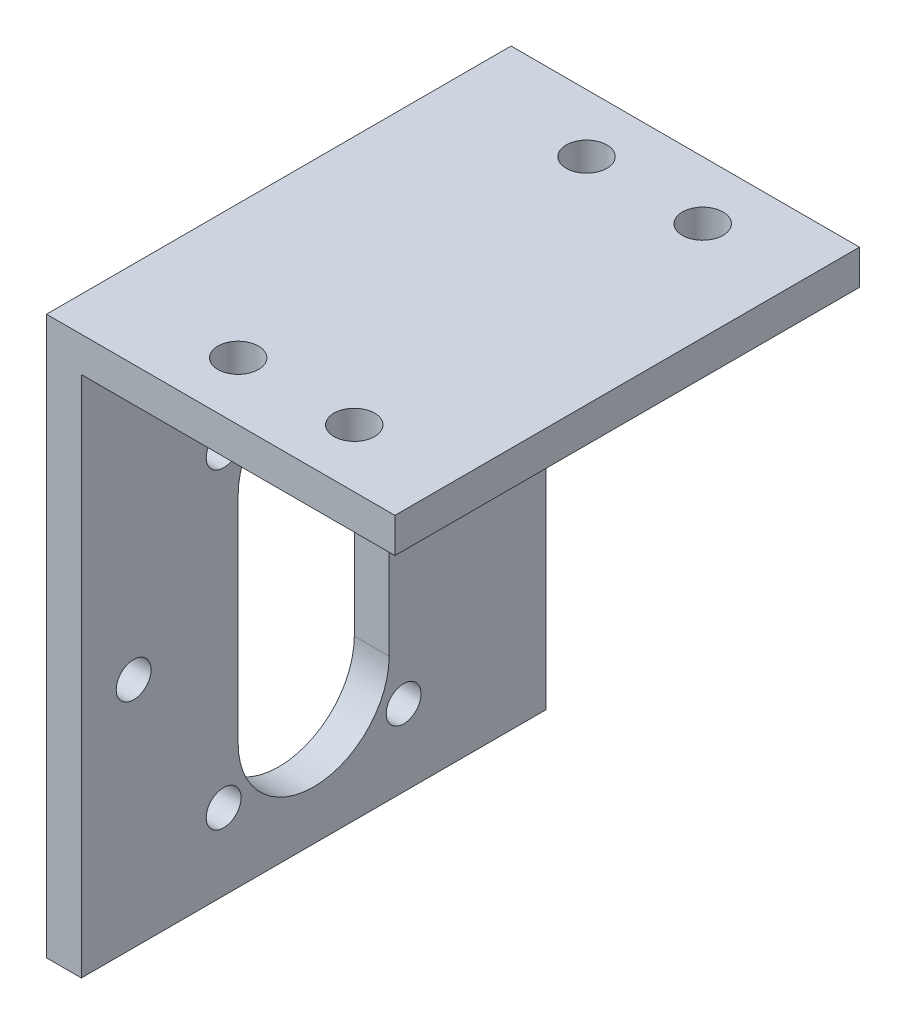
ISO-10303-21;
HEADER;
FILE_DESCRIPTION(('STEP AP214'),'2;1');
FILE_NAME('part.step','',(''),(''),'','','');
FILE_SCHEMA(('AUTOMOTIVE_DESIGN { 1 0 10303 214 1 1 1 1 }'));
ENDSEC;
DATA;
#1=APPLICATION_CONTEXT('core data for automotive mechanical design processes');
#2=APPLICATION_PROTOCOL_DEFINITION('international standard','automotive_design',2000,#1);
#3=PRODUCT_CONTEXT('',#1,'mechanical');
#4=PRODUCT('Part','Part','',(#3));
#5=PRODUCT_RELATED_PRODUCT_CATEGORY('part','',(#4));
#6=PRODUCT_DEFINITION_FORMATION('','',#4);
#7=PRODUCT_DEFINITION_CONTEXT('part definition',#1,'design');
#8=PRODUCT_DEFINITION('design','',#6,#7);
#9=PRODUCT_DEFINITION_SHAPE('','',#8);
#10=(LENGTH_UNIT() NAMED_UNIT(*) SI_UNIT(.MILLI.,.METRE.));
#11=(NAMED_UNIT(*) PLANE_ANGLE_UNIT() SI_UNIT($,.RADIAN.));
#12=(NAMED_UNIT(*) SI_UNIT($,.STERADIAN.) SOLID_ANGLE_UNIT());
#13=UNCERTAINTY_MEASURE_WITH_UNIT(LENGTH_MEASURE(1.E-05),#10,'distance_accuracy_value','');
#14=(GEOMETRIC_REPRESENTATION_CONTEXT(3) GLOBAL_UNCERTAINTY_ASSIGNED_CONTEXT((#13)) GLOBAL_UNIT_ASSIGNED_CONTEXT((#10,
#11,#12)) REPRESENTATION_CONTEXT('',''));
#15=CARTESIAN_POINT('',(0.,0.,0.));
#16=DIRECTION('',(0.,0.,1.));
#17=DIRECTION('',(1.,0.,0.));
#18=AXIS2_PLACEMENT_3D('',#15,#16,#17);
#19=CARTESIAN_POINT('',(0.,48.,0.));
#20=DIRECTION('',(1.,0.,0.));
#21=DIRECTION('',(0.,0.,-1.));
#22=AXIS2_PLACEMENT_3D('',#19,#20,#21);
#23=PLANE('',#22);
#24=CARTESIAN_POINT('',(0.,19.9999999999998,35.5));
#25=DIRECTION('',(-1.,0.,0.));
#26=DIRECTION('',(0.,0.,1.));
#27=AXIS2_PLACEMENT_3D('',#24,#25,#26);
#28=CIRCLE('',#27,1.5);
#29=CARTESIAN_POINT('',(0.,19.9999999999998,37.));
#30=VERTEX_POINT('',#29);
#31=EDGE_CURVE('E244',#30,#30,#28,.T.);
#32=ORIENTED_EDGE('',*,*,#31,.F.);
#33=EDGE_LOOP('',(#32));
#34=FACE_BOUND('',#33,.T.);
#35=CARTESIAN_POINT('',(0.,33.4233937586587,27.7500000000001));
#36=DIRECTION('',(-1.,0.,0.));
#37=DIRECTION('',(0.,0.,1.));
#38=AXIS2_PLACEMENT_3D('',#35,#36,#37);
#39=CIRCLE('',#38,1.5);
#40=CARTESIAN_POINT('',(0.,33.4233937586587,29.2500000000001));
#41=VERTEX_POINT('',#40);
#42=EDGE_CURVE('E234',#41,#41,#39,.T.);
#43=ORIENTED_EDGE('',*,*,#42,.F.);
#44=EDGE_LOOP('',(#43));
#45=FACE_BOUND('',#44,.T.);
#46=CARTESIAN_POINT('',(0.,33.4233937586589,12.2500000000001));
#47=DIRECTION('',(-1.,0.,0.));
#48=DIRECTION('',(0.,0.,1.));
#49=AXIS2_PLACEMENT_3D('',#46,#47,#48);
#50=CIRCLE('',#49,1.5);
#51=CARTESIAN_POINT('',(0.,33.4233937586589,13.7500000000001));
#52=VERTEX_POINT('',#51);
#53=EDGE_CURVE('E231',#52,#52,#50,.T.);
#54=ORIENTED_EDGE('',*,*,#53,.F.);
#55=EDGE_LOOP('',(#54));
#56=FACE_BOUND('',#55,.T.);
#57=CARTESIAN_POINT('',(0.,20.0000000000001,4.49999999999999));
#58=DIRECTION('',(-1.,0.,0.));
#59=DIRECTION('',(0.,0.,1.));
#60=AXIS2_PLACEMENT_3D('',#57,#58,#59);
#61=CIRCLE('',#60,1.5);
#62=CARTESIAN_POINT('',(0.,20.0000000000001,5.99999999999999));
#63=VERTEX_POINT('',#62);
#64=EDGE_CURVE('E228',#63,#63,#61,.T.);
#65=ORIENTED_EDGE('',*,*,#64,.F.);
#66=EDGE_LOOP('',(#65));
#67=FACE_BOUND('',#66,.T.);
#68=CARTESIAN_POINT('',(0.,6.57660624134121,12.25));
#69=DIRECTION('',(-1.,0.,0.));
#70=DIRECTION('',(0.,0.,1.));
#71=AXIS2_PLACEMENT_3D('',#68,#69,#70);
#72=CIRCLE('',#71,1.5);
#73=CARTESIAN_POINT('',(0.,6.57660624134121,13.75));
#74=VERTEX_POINT('',#73);
#75=EDGE_CURVE('E224',#74,#74,#72,.T.);
#76=ORIENTED_EDGE('',*,*,#75,.F.);
#77=EDGE_LOOP('',(#76));
#78=FACE_BOUND('',#77,.T.);
#79=CARTESIAN_POINT('',(0.,10.7478892517407,20.));
#80=DIRECTION('',(-1.,0.,0.));
#81=DIRECTION('',(0.,0.,-1.));
#82=AXIS2_PLACEMENT_3D('',#79,#80,#81);
#83=CIRCLE('',#82,6.49999999999999);
#84=CARTESIAN_POINT('',(0.,10.7478892517407,13.5));
#85=VERTEX_POINT('',#84);
#86=CARTESIAN_POINT('',(0.,10.7478892517407,26.5));
#87=VERTEX_POINT('',#86);
#88=EDGE_CURVE('E122',#85,#87,#83,.T.);
#89=ORIENTED_EDGE('',*,*,#88,.F.);
#90=DIRECTION('',(0.,-1.,0.));
#91=VECTOR('',#90,1.);
#92=CARTESIAN_POINT('',(0.,20.,13.5));
#93=LINE('',#92,#91);
#94=CARTESIAN_POINT('',(0.,29.2521107482593,13.5));
#95=VERTEX_POINT('',#94);
#96=EDGE_CURVE('E49',#95,#85,#93,.T.);
#97=ORIENTED_EDGE('',*,*,#96,.F.);
#98=CARTESIAN_POINT('',(0.,29.2521107482593,20.));
#99=DIRECTION('',(-1.,0.,0.));
#100=DIRECTION('',(0.,0.,1.));
#101=AXIS2_PLACEMENT_3D('',#98,#99,#100);
#102=CIRCLE('',#101,6.5);
#103=CARTESIAN_POINT('',(0.,29.2521107482593,26.5));
#104=VERTEX_POINT('',#103);
#105=EDGE_CURVE('E129',#104,#95,#102,.T.);
#106=ORIENTED_EDGE('',*,*,#105,.F.);
#107=DIRECTION('',(0.,1.,0.));
#108=VECTOR('',#107,1.);
#109=CARTESIAN_POINT('',(0.,20.,26.5));
#110=LINE('',#109,#108);
#111=EDGE_CURVE('E113',#87,#104,#110,.T.);
#112=ORIENTED_EDGE('',*,*,#111,.F.);
#113=EDGE_LOOP('',(#89,#97,#106,#112));
#114=FACE_BOUND('',#113,.T.);
#115=CARTESIAN_POINT('',(0.,6.57660624134121,27.75));
#116=DIRECTION('',(-1.,0.,0.));
#117=DIRECTION('',(0.,0.,1.));
#118=AXIS2_PLACEMENT_3D('',#115,#116,#117);
#119=CIRCLE('',#118,1.5);
#120=CARTESIAN_POINT('',(0.,6.57660624134121,29.25));
#121=VERTEX_POINT('',#120);
#122=EDGE_CURVE('E137',#121,#121,#119,.T.);
#123=ORIENTED_EDGE('',*,*,#122,.F.);
#124=EDGE_LOOP('',(#123));
#125=FACE_BOUND('',#124,.T.);
#126=DIRECTION('',(0.,0.,1.));
#127=VECTOR('',#126,1.);
#128=CARTESIAN_POINT('',(0.,0.,0.));
#129=LINE('',#128,#127);
#130=CARTESIAN_POINT('',(0.,0.,0.));
#131=VERTEX_POINT('',#130);
#132=CARTESIAN_POINT('',(0.,0.,40.));
#133=VERTEX_POINT('',#132);
#134=EDGE_CURVE('E187',#131,#133,#129,.T.);
#135=ORIENTED_EDGE('',*,*,#134,.T.);
#136=DIRECTION('',(0.,-1.,0.));
#137=VECTOR('',#136,1.);
#138=CARTESIAN_POINT('',(0.,48.,40.));
#139=LINE('',#138,#137);
#140=CARTESIAN_POINT('',(0.,48.,40.));
#141=VERTEX_POINT('',#140);
#142=EDGE_CURVE('E213',#141,#133,#139,.T.);
#143=ORIENTED_EDGE('',*,*,#142,.F.);
#144=DIRECTION('',(0.,0.,1.));
#145=VECTOR('',#144,1.);
#146=CARTESIAN_POINT('',(0.,48.,0.));
#147=LINE('',#146,#145);
#148=CARTESIAN_POINT('',(0.,48.,0.));
#149=VERTEX_POINT('',#148);
#150=EDGE_CURVE('E188',#149,#141,#147,.T.);
#151=ORIENTED_EDGE('',*,*,#150,.F.);
#152=DIRECTION('',(0.,-1.,0.));
#153=VECTOR('',#152,1.);
#154=CARTESIAN_POINT('',(0.,48.,0.));
#155=LINE('',#154,#153);
#156=EDGE_CURVE('E198',#149,#131,#155,.T.);
#157=ORIENTED_EDGE('',*,*,#156,.T.);
#158=EDGE_LOOP('',(#135,#143,#151,#157));
#159=FACE_BOUND('',#158,.T.);
#160=ADVANCED_FACE('F33',(#34,#45,#56,#67,#78,#114,#125,#159),#23,.F.);
#161=CARTESIAN_POINT('',(0.,48.,40.));
#162=DIRECTION('',(0.,0.,-1.));
#163=DIRECTION('',(-1.,0.,0.));
#164=AXIS2_PLACEMENT_3D('',#161,#162,#163);
#165=PLANE('',#164);
#166=DIRECTION('',(0.,-1.,0.));
#167=VECTOR('',#166,1.);
#168=CARTESIAN_POINT('',(3.,48.,40.));
#169=LINE('',#168,#167);
#170=CARTESIAN_POINT('',(3.,45.,40.));
#171=VERTEX_POINT('',#170);
#172=CARTESIAN_POINT('',(3.,0.,40.));
#173=VERTEX_POINT('',#172);
#174=EDGE_CURVE('E177',#171,#173,#169,.T.);
#175=ORIENTED_EDGE('',*,*,#174,.F.);
#176=DIRECTION('',(1.,0.,0.));
#177=VECTOR('',#176,1.);
#178=CARTESIAN_POINT('',(0.,45.,40.));
#179=LINE('',#178,#177);
#180=CARTESIAN_POINT('',(30.,45.,40.));
#181=VERTEX_POINT('',#180);
#182=EDGE_CURVE('E171',#171,#181,#179,.T.);
#183=ORIENTED_EDGE('',*,*,#182,.T.);
#184=DIRECTION('',(0.,-1.,0.));
#185=VECTOR('',#184,1.);
#186=CARTESIAN_POINT('',(30.,48.,40.));
#187=LINE('',#186,#185);
#188=CARTESIAN_POINT('',(30.,48.,40.));
#189=VERTEX_POINT('',#188);
#190=EDGE_CURVE('E210',#189,#181,#187,.T.);
#191=ORIENTED_EDGE('',*,*,#190,.F.);
#192=DIRECTION('',(1.,0.,0.));
#193=VECTOR('',#192,1.);
#194=CARTESIAN_POINT('',(0.,48.,40.));
#195=LINE('',#194,#193);
#196=EDGE_CURVE('E191',#141,#189,#195,.T.);
#197=ORIENTED_EDGE('',*,*,#196,.F.);
#198=ORIENTED_EDGE('',*,*,#142,.T.);
#199=DIRECTION('',(1.,0.,0.));
#200=VECTOR('',#199,1.);
#201=CARTESIAN_POINT('',(0.,0.,40.));
#202=LINE('',#201,#200);
#203=EDGE_CURVE('E201',#133,#173,#202,.T.);
#204=ORIENTED_EDGE('',*,*,#203,.T.);
#205=EDGE_LOOP('',(#175,#183,#191,#197,#198,#204));
#206=FACE_BOUND('',#205,.T.);
#207=ADVANCED_FACE('F254',(#206),#165,.F.);
#208=CARTESIAN_POINT('',(30.,48.,0.));
#209=DIRECTION('',(-1.,0.,0.));
#210=DIRECTION('',(0.,0.,1.));
#211=AXIS2_PLACEMENT_3D('',#208,#209,#210);
#212=PLANE('',#211);
#213=ORIENTED_EDGE('',*,*,#190,.T.);
#214=DIRECTION('',(0.,0.,-1.));
#215=VECTOR('',#214,1.);
#216=CARTESIAN_POINT('',(30.,45.,0.));
#217=LINE('',#216,#215);
#218=CARTESIAN_POINT('',(30.,45.,0.));
#219=VERTEX_POINT('',#218);
#220=EDGE_CURVE('E181',#181,#219,#217,.T.);
#221=ORIENTED_EDGE('',*,*,#220,.T.);
#222=DIRECTION('',(0.,-1.,0.));
#223=VECTOR('',#222,1.);
#224=CARTESIAN_POINT('',(30.,48.,0.));
#225=LINE('',#224,#223);
#226=CARTESIAN_POINT('',(30.,48.,0.));
#227=VERTEX_POINT('',#226);
#228=EDGE_CURVE('E207',#227,#219,#225,.T.);
#229=ORIENTED_EDGE('',*,*,#228,.F.);
#230=DIRECTION('',(0.,0.,-1.));
#231=VECTOR('',#230,1.);
#232=CARTESIAN_POINT('',(30.,48.,0.));
#233=LINE('',#232,#231);
#234=EDGE_CURVE('E194',#189,#227,#233,.T.);
#235=ORIENTED_EDGE('',*,*,#234,.F.);
#236=EDGE_LOOP('',(#213,#221,#229,#235));
#237=FACE_BOUND('',#236,.T.);
#238=ADVANCED_FACE('F259',(#237),#212,.F.);
#239=CARTESIAN_POINT('',(0.,48.,0.));
#240=DIRECTION('',(0.,0.,1.));
#241=DIRECTION('',(1.,0.,0.));
#242=AXIS2_PLACEMENT_3D('',#239,#240,#241);
#243=PLANE('',#242);
#244=DIRECTION('',(-1.,0.,0.));
#245=VECTOR('',#244,1.);
#246=CARTESIAN_POINT('',(0.,45.,0.));
#247=LINE('',#246,#245);
#248=CARTESIAN_POINT('',(3.,45.,0.));
#249=VERTEX_POINT('',#248);
#250=EDGE_CURVE('E178',#219,#249,#247,.T.);
#251=ORIENTED_EDGE('',*,*,#250,.T.);
#252=DIRECTION('',(0.,-1.,0.));
#253=VECTOR('',#252,1.);
#254=CARTESIAN_POINT('',(3.,48.,0.));
#255=LINE('',#254,#253);
#256=CARTESIAN_POINT('',(3.,0.,0.));
#257=VERTEX_POINT('',#256);
#258=EDGE_CURVE('E174',#249,#257,#255,.T.);
#259=ORIENTED_EDGE('',*,*,#258,.T.);
#260=DIRECTION('',(-1.,0.,0.));
#261=VECTOR('',#260,1.);
#262=CARTESIAN_POINT('',(0.,0.,0.));
#263=LINE('',#262,#261);
#264=EDGE_CURVE('E192',#257,#131,#263,.T.);
#265=ORIENTED_EDGE('',*,*,#264,.T.);
#266=ORIENTED_EDGE('',*,*,#156,.F.);
#267=DIRECTION('',(-1.,0.,0.));
#268=VECTOR('',#267,1.);
#269=CARTESIAN_POINT('',(0.,48.,0.));
#270=LINE('',#269,#268);
#271=EDGE_CURVE('E196',#227,#149,#270,.T.);
#272=ORIENTED_EDGE('',*,*,#271,.F.);
#273=ORIENTED_EDGE('',*,*,#228,.T.);
#274=EDGE_LOOP('',(#251,#259,#265,#266,#272,#273));
#275=FACE_BOUND('',#274,.T.);
#276=ADVANCED_FACE('F328',(#275),#243,.F.);
#277=CARTESIAN_POINT('',(0.,48.,0.));
#278=DIRECTION('',(0.,1.,0.));
#279=DIRECTION('',(0.,0.,1.));
#280=AXIS2_PLACEMENT_3D('',#277,#278,#279);
#281=PLANE('',#280);
#282=CARTESIAN_POINT('',(11.5,48.,5.));
#283=DIRECTION('',(0.,-1.,0.));
#284=DIRECTION('',(0.,0.,1.));
#285=AXIS2_PLACEMENT_3D('',#282,#283,#284);
#286=CIRCLE('',#285,1.75);
#287=CARTESIAN_POINT('',(11.5,48.,6.75));
#288=VERTEX_POINT('',#287);
#289=EDGE_CURVE('E143',#288,#288,#286,.T.);
#290=ORIENTED_EDGE('',*,*,#289,.T.);
#291=EDGE_LOOP('',(#290));
#292=FACE_BOUND('',#291,.T.);
#293=CARTESIAN_POINT('',(21.5,48.,5.));
#294=DIRECTION('',(0.,-1.,0.));
#295=DIRECTION('',(0.,0.,1.));
#296=AXIS2_PLACEMENT_3D('',#293,#294,#295);
#297=CIRCLE('',#296,1.75);
#298=CARTESIAN_POINT('',(21.5,48.,6.75));
#299=VERTEX_POINT('',#298);
#300=EDGE_CURVE('E150',#299,#299,#297,.T.);
#301=ORIENTED_EDGE('',*,*,#300,.T.);
#302=EDGE_LOOP('',(#301));
#303=FACE_BOUND('',#302,.T.);
#304=CARTESIAN_POINT('',(21.5,48.,35.));
#305=DIRECTION('',(0.,-1.,0.));
#306=DIRECTION('',(0.,0.,-1.));
#307=AXIS2_PLACEMENT_3D('',#304,#305,#306);
#308=CIRCLE('',#307,1.75);
#309=CARTESIAN_POINT('',(21.5,48.,33.25));
#310=VERTEX_POINT('',#309);
#311=EDGE_CURVE('E156',#310,#310,#308,.T.);
#312=ORIENTED_EDGE('',*,*,#311,.T.);
#313=EDGE_LOOP('',(#312));
#314=FACE_BOUND('',#313,.T.);
#315=CARTESIAN_POINT('',(11.5,48.,35.));
#316=DIRECTION('',(0.,-1.,0.));
#317=DIRECTION('',(0.,0.,-1.));
#318=AXIS2_PLACEMENT_3D('',#315,#316,#317);
#319=CIRCLE('',#318,1.75);
#320=CARTESIAN_POINT('',(11.5,48.,33.25));
#321=VERTEX_POINT('',#320);
#322=EDGE_CURVE('E162',#321,#321,#319,.T.);
#323=ORIENTED_EDGE('',*,*,#322,.T.);
#324=EDGE_LOOP('',(#323));
#325=FACE_BOUND('',#324,.T.);
#326=ORIENTED_EDGE('',*,*,#150,.T.);
#327=ORIENTED_EDGE('',*,*,#196,.T.);
#328=ORIENTED_EDGE('',*,*,#234,.T.);
#329=ORIENTED_EDGE('',*,*,#271,.T.);
#330=EDGE_LOOP('',(#326,#327,#328,#329));
#331=FACE_BOUND('',#330,.T.);
#332=ADVANCED_FACE('F325',(#292,#303,#314,#325,#331),#281,.T.);
#333=CARTESIAN_POINT('',(0.,0.,0.));
#334=DIRECTION('',(0.,1.,0.));
#335=DIRECTION('',(0.,0.,1.));
#336=AXIS2_PLACEMENT_3D('',#333,#334,#335);
#337=PLANE('',#336);
#338=ORIENTED_EDGE('',*,*,#264,.F.);
#339=DIRECTION('',(0.,0.,1.));
#340=VECTOR('',#339,1.);
#341=CARTESIAN_POINT('',(3.,0.,0.));
#342=LINE('',#341,#340);
#343=EDGE_CURVE('E165',#257,#173,#342,.T.);
#344=ORIENTED_EDGE('',*,*,#343,.T.);
#345=ORIENTED_EDGE('',*,*,#203,.F.);
#346=ORIENTED_EDGE('',*,*,#134,.F.);
#347=EDGE_LOOP('',(#338,#344,#345,#346));
#348=FACE_BOUND('',#347,.T.);
#349=ADVANCED_FACE('F320',(#348),#337,.F.);
#350=CARTESIAN_POINT('',(3.,48.,0.));
#351=DIRECTION('',(1.,0.,0.));
#352=DIRECTION('',(0.,0.,-1.));
#353=AXIS2_PLACEMENT_3D('',#350,#351,#352);
#354=PLANE('',#353);
#355=CARTESIAN_POINT('',(3.,19.9999999999998,35.5));
#356=DIRECTION('',(1.,0.,0.));
#357=DIRECTION('',(0.,0.,-1.));
#358=AXIS2_PLACEMENT_3D('',#355,#356,#357);
#359=CIRCLE('',#358,1.5);
#360=CARTESIAN_POINT('',(3.,19.9999999999998,34.));
#361=VERTEX_POINT('',#360);
#362=EDGE_CURVE('E36',#361,#361,#359,.T.);
#363=ORIENTED_EDGE('',*,*,#362,.F.);
#364=EDGE_LOOP('',(#363));
#365=FACE_BOUND('',#364,.T.);
#366=CARTESIAN_POINT('',(3.,33.4233937586587,27.7500000000001));
#367=DIRECTION('',(1.,0.,0.));
#368=DIRECTION('',(0.,0.,-1.));
#369=AXIS2_PLACEMENT_3D('',#366,#367,#368);
#370=CIRCLE('',#369,1.5);
#371=CARTESIAN_POINT('',(3.,33.4233937586587,26.2500000000001));
#372=VERTEX_POINT('',#371);
#373=EDGE_CURVE('E232',#372,#372,#370,.T.);
#374=ORIENTED_EDGE('',*,*,#373,.F.);
#375=EDGE_LOOP('',(#374));
#376=FACE_BOUND('',#375,.T.);
#377=CARTESIAN_POINT('',(3.,33.4233937586589,12.2500000000001));
#378=DIRECTION('',(1.,0.,0.));
#379=DIRECTION('',(0.,0.,-1.));
#380=AXIS2_PLACEMENT_3D('',#377,#378,#379);
#381=CIRCLE('',#380,1.5);
#382=CARTESIAN_POINT('',(3.,33.4233937586589,10.7500000000001));
#383=VERTEX_POINT('',#382);
#384=EDGE_CURVE('E229',#383,#383,#381,.T.);
#385=ORIENTED_EDGE('',*,*,#384,.F.);
#386=EDGE_LOOP('',(#385));
#387=FACE_BOUND('',#386,.T.);
#388=CARTESIAN_POINT('',(3.,20.0000000000001,4.49999999999999));
#389=DIRECTION('',(1.,0.,0.));
#390=DIRECTION('',(0.,0.,-1.));
#391=AXIS2_PLACEMENT_3D('',#388,#389,#390);
#392=CIRCLE('',#391,1.5);
#393=CARTESIAN_POINT('',(3.,20.0000000000001,2.99999999999999));
#394=VERTEX_POINT('',#393);
#395=EDGE_CURVE('E225',#394,#394,#392,.T.);
#396=ORIENTED_EDGE('',*,*,#395,.F.);
#397=EDGE_LOOP('',(#396));
#398=FACE_BOUND('',#397,.T.);
#399=CARTESIAN_POINT('',(3.,6.57660624134121,12.25));
#400=DIRECTION('',(1.,0.,0.));
#401=DIRECTION('',(0.,0.,-1.));
#402=AXIS2_PLACEMENT_3D('',#399,#400,#401);
#403=CIRCLE('',#402,1.5);
#404=CARTESIAN_POINT('',(3.,6.57660624134121,10.75));
#405=VERTEX_POINT('',#404);
#406=EDGE_CURVE('E125',#405,#405,#403,.T.);
#407=ORIENTED_EDGE('',*,*,#406,.F.);
#408=EDGE_LOOP('',(#407));
#409=FACE_BOUND('',#408,.T.);
#410=DIRECTION('',(0.,1.,0.));
#411=VECTOR('',#410,1.);
#412=CARTESIAN_POINT('',(3.,48.,13.5));
#413=LINE('',#412,#411);
#414=CARTESIAN_POINT('',(3.,10.7478892517407,13.5));
#415=VERTEX_POINT('',#414);
#416=CARTESIAN_POINT('',(3.,29.2521107482593,13.5));
#417=VERTEX_POINT('',#416);
#418=EDGE_CURVE('E11',#415,#417,#413,.T.);
#419=ORIENTED_EDGE('',*,*,#418,.F.);
#420=CARTESIAN_POINT('',(3.,10.7478892517407,20.));
#421=DIRECTION('',(1.,0.,0.));
#422=DIRECTION('',(0.,0.,-1.));
#423=AXIS2_PLACEMENT_3D('',#420,#421,#422);
#424=CIRCLE('',#423,6.49999999999999);
#425=CARTESIAN_POINT('',(3.,10.7478892517407,26.5));
#426=VERTEX_POINT('',#425);
#427=EDGE_CURVE('E216',#426,#415,#424,.T.);
#428=ORIENTED_EDGE('',*,*,#427,.F.);
#429=DIRECTION('',(0.,-1.,0.));
#430=VECTOR('',#429,1.);
#431=CARTESIAN_POINT('',(3.,48.,26.5));
#432=LINE('',#431,#430);
#433=CARTESIAN_POINT('',(3.,29.2521107482593,26.5));
#434=VERTEX_POINT('',#433);
#435=EDGE_CURVE('E116',#434,#426,#432,.T.);
#436=ORIENTED_EDGE('',*,*,#435,.F.);
#437=CARTESIAN_POINT('',(3.,29.2521107482593,20.));
#438=DIRECTION('',(1.,0.,0.));
#439=DIRECTION('',(0.,0.,-1.));
#440=AXIS2_PLACEMENT_3D('',#437,#438,#439);
#441=CIRCLE('',#440,6.5);
#442=EDGE_CURVE('E41',#417,#434,#441,.T.);
#443=ORIENTED_EDGE('',*,*,#442,.F.);
#444=EDGE_LOOP('',(#419,#428,#436,#443));
#445=FACE_BOUND('',#444,.T.);
#446=CARTESIAN_POINT('',(3.,6.57660624134121,27.75));
#447=DIRECTION('',(1.,0.,0.));
#448=DIRECTION('',(0.,0.,-1.));
#449=AXIS2_PLACEMENT_3D('',#446,#447,#448);
#450=CIRCLE('',#449,1.5);
#451=CARTESIAN_POINT('',(3.,6.57660624134121,26.25));
#452=VERTEX_POINT('',#451);
#453=EDGE_CURVE('E142',#452,#452,#450,.T.);
#454=ORIENTED_EDGE('',*,*,#453,.F.);
#455=EDGE_LOOP('',(#454));
#456=FACE_BOUND('',#455,.T.);
#457=ORIENTED_EDGE('',*,*,#343,.F.);
#458=ORIENTED_EDGE('',*,*,#258,.F.);
#459=DIRECTION('',(0.,0.,1.));
#460=VECTOR('',#459,1.);
#461=CARTESIAN_POINT('',(3.,45.,0.));
#462=LINE('',#461,#460);
#463=EDGE_CURVE('E168',#249,#171,#462,.T.);
#464=ORIENTED_EDGE('',*,*,#463,.T.);
#465=ORIENTED_EDGE('',*,*,#174,.T.);
#466=EDGE_LOOP('',(#457,#458,#464,#465));
#467=FACE_BOUND('',#466,.T.);
#468=ADVANCED_FACE('F317',(#365,#376,#387,#398,#409,#445,#456,#467),#354,.T.);
#469=CARTESIAN_POINT('',(0.,45.,0.));
#470=DIRECTION('',(0.,1.,0.));
#471=DIRECTION('',(0.,0.,1.));
#472=AXIS2_PLACEMENT_3D('',#469,#470,#471);
#473=PLANE('',#472);
#474=CARTESIAN_POINT('',(11.5,45.,5.));
#475=DIRECTION('',(0.,-1.,0.));
#476=DIRECTION('',(0.,0.,1.));
#477=AXIS2_PLACEMENT_3D('',#474,#475,#476);
#478=CIRCLE('',#477,1.75);
#479=CARTESIAN_POINT('',(11.5,45.,6.75));
#480=VERTEX_POINT('',#479);
#481=EDGE_CURVE('E147',#480,#480,#478,.T.);
#482=ORIENTED_EDGE('',*,*,#481,.F.);
#483=EDGE_LOOP('',(#482));
#484=FACE_BOUND('',#483,.T.);
#485=CARTESIAN_POINT('',(21.5,45.,5.));
#486=DIRECTION('',(0.,-1.,0.));
#487=DIRECTION('',(0.,0.,1.));
#488=AXIS2_PLACEMENT_3D('',#485,#486,#487);
#489=CIRCLE('',#488,1.75);
#490=CARTESIAN_POINT('',(21.5,45.,6.75));
#491=VERTEX_POINT('',#490);
#492=EDGE_CURVE('E146',#491,#491,#489,.T.);
#493=ORIENTED_EDGE('',*,*,#492,.F.);
#494=EDGE_LOOP('',(#493));
#495=FACE_BOUND('',#494,.T.);
#496=CARTESIAN_POINT('',(21.5,45.,35.));
#497=DIRECTION('',(0.,-1.,0.));
#498=DIRECTION('',(0.,0.,-1.));
#499=AXIS2_PLACEMENT_3D('',#496,#497,#498);
#500=CIRCLE('',#499,1.75);
#501=CARTESIAN_POINT('',(21.5,45.,33.25));
#502=VERTEX_POINT('',#501);
#503=EDGE_CURVE('E153',#502,#502,#500,.T.);
#504=ORIENTED_EDGE('',*,*,#503,.F.);
#505=EDGE_LOOP('',(#504));
#506=FACE_BOUND('',#505,.T.);
#507=CARTESIAN_POINT('',(11.5,45.,35.));
#508=DIRECTION('',(0.,-1.,0.));
#509=DIRECTION('',(0.,0.,-1.));
#510=AXIS2_PLACEMENT_3D('',#507,#508,#509);
#511=CIRCLE('',#510,1.75);
#512=CARTESIAN_POINT('',(11.5,45.,33.25));
#513=VERTEX_POINT('',#512);
#514=EDGE_CURVE('E159',#513,#513,#511,.T.);
#515=ORIENTED_EDGE('',*,*,#514,.F.);
#516=EDGE_LOOP('',(#515));
#517=FACE_BOUND('',#516,.T.);
#518=ORIENTED_EDGE('',*,*,#463,.F.);
#519=ORIENTED_EDGE('',*,*,#250,.F.);
#520=ORIENTED_EDGE('',*,*,#220,.F.);
#521=ORIENTED_EDGE('',*,*,#182,.F.);
#522=EDGE_LOOP('',(#518,#519,#520,#521));
#523=FACE_BOUND('',#522,.T.);
#524=ADVANCED_FACE('F315',(#484,#495,#506,#517,#523),#473,.F.);
#525=CARTESIAN_POINT('',(11.5,48.,35.));
#526=DIRECTION('',(0.,-1.,0.));
#527=DIRECTION('',(0.,0.,-1.));
#528=AXIS2_PLACEMENT_3D('',#525,#526,#527);
#529=CYLINDRICAL_SURFACE('',#528,1.75);
#530=ORIENTED_EDGE('',*,*,#322,.F.);
#531=EDGE_LOOP('',(#530));
#532=FACE_BOUND('',#531,.T.);
#533=ORIENTED_EDGE('',*,*,#514,.T.);
#534=EDGE_LOOP('',(#533));
#535=FACE_BOUND('',#534,.T.);
#536=ADVANCED_FACE('F311',(#532,#535),#529,.F.);
#537=CARTESIAN_POINT('',(21.5,48.,35.));
#538=DIRECTION('',(0.,-1.,0.));
#539=DIRECTION('',(0.,0.,-1.));
#540=AXIS2_PLACEMENT_3D('',#537,#538,#539);
#541=CYLINDRICAL_SURFACE('',#540,1.75);
#542=ORIENTED_EDGE('',*,*,#311,.F.);
#543=EDGE_LOOP('',(#542));
#544=FACE_BOUND('',#543,.T.);
#545=ORIENTED_EDGE('',*,*,#503,.T.);
#546=EDGE_LOOP('',(#545));
#547=FACE_BOUND('',#546,.T.);
#548=ADVANCED_FACE('F307',(#544,#547),#541,.F.);
#549=CARTESIAN_POINT('',(21.5,48.,5.));
#550=DIRECTION('',(0.,-1.,0.));
#551=DIRECTION('',(0.,0.,-1.));
#552=AXIS2_PLACEMENT_3D('',#549,#550,#551);
#553=CYLINDRICAL_SURFACE('',#552,1.75);
#554=ORIENTED_EDGE('',*,*,#300,.F.);
#555=EDGE_LOOP('',(#554));
#556=FACE_BOUND('',#555,.T.);
#557=ORIENTED_EDGE('',*,*,#492,.T.);
#558=EDGE_LOOP('',(#557));
#559=FACE_BOUND('',#558,.T.);
#560=ADVANCED_FACE('F303',(#556,#559),#553,.F.);
#561=CARTESIAN_POINT('',(11.5,48.,5.));
#562=DIRECTION('',(0.,-1.,0.));
#563=DIRECTION('',(0.,0.,-1.));
#564=AXIS2_PLACEMENT_3D('',#561,#562,#563);
#565=CYLINDRICAL_SURFACE('',#564,1.75);
#566=ORIENTED_EDGE('',*,*,#289,.F.);
#567=EDGE_LOOP('',(#566));
#568=FACE_BOUND('',#567,.T.);
#569=ORIENTED_EDGE('',*,*,#481,.T.);
#570=EDGE_LOOP('',(#569));
#571=FACE_BOUND('',#570,.T.);
#572=ADVANCED_FACE('F299',(#568,#571),#565,.F.);
#573=CARTESIAN_POINT('',(30.,6.57660624134121,27.75));
#574=DIRECTION('',(-1.,0.,0.));
#575=DIRECTION('',(0.,0.,1.));
#576=AXIS2_PLACEMENT_3D('',#573,#574,#575);
#577=CYLINDRICAL_SURFACE('',#576,1.5);
#578=ORIENTED_EDGE('',*,*,#453,.T.);
#579=EDGE_LOOP('',(#578));
#580=FACE_BOUND('',#579,.T.);
#581=ORIENTED_EDGE('',*,*,#122,.T.);
#582=EDGE_LOOP('',(#581));
#583=FACE_BOUND('',#582,.T.);
#584=ADVANCED_FACE('F289',(#580,#583),#577,.F.);
#585=CARTESIAN_POINT('',(30.,20.,13.5));
#586=DIRECTION('',(0.,0.,-1.));
#587=DIRECTION('',(-1.,0.,0.));
#588=AXIS2_PLACEMENT_3D('',#585,#586,#587);
#589=PLANE('',#588);
#590=ORIENTED_EDGE('',*,*,#418,.T.);
#591=DIRECTION('',(-1.,0.,0.));
#592=VECTOR('',#591,1.);
#593=CARTESIAN_POINT('',(30.,29.2521107482593,13.5));
#594=LINE('',#593,#592);
#595=EDGE_CURVE('E135',#417,#95,#594,.T.);
#596=ORIENTED_EDGE('',*,*,#595,.T.);
#597=ORIENTED_EDGE('',*,*,#96,.T.);
#598=DIRECTION('',(-1.,0.,0.));
#599=VECTOR('',#598,1.);
#600=CARTESIAN_POINT('',(30.,10.7478892517407,13.5));
#601=LINE('',#600,#599);
#602=EDGE_CURVE('E119',#415,#85,#601,.T.);
#603=ORIENTED_EDGE('',*,*,#602,.F.);
#604=EDGE_LOOP('',(#590,#596,#597,#603));
#605=FACE_BOUND('',#604,.T.);
#606=ADVANCED_FACE('F285',(#605),#589,.F.);
#607=CARTESIAN_POINT('',(30.,29.2521107482593,20.));
#608=DIRECTION('',(-1.,0.,0.));
#609=DIRECTION('',(0.,0.,1.));
#610=AXIS2_PLACEMENT_3D('',#607,#608,#609);
#611=CYLINDRICAL_SURFACE('',#610,6.5);
#612=ORIENTED_EDGE('',*,*,#442,.T.);
#613=DIRECTION('',(-1.,0.,0.));
#614=VECTOR('',#613,1.);
#615=CARTESIAN_POINT('',(30.,29.2521107482593,26.5));
#616=LINE('',#615,#614);
#617=EDGE_CURVE('E118',#434,#104,#616,.T.);
#618=ORIENTED_EDGE('',*,*,#617,.T.);
#619=ORIENTED_EDGE('',*,*,#105,.T.);
#620=ORIENTED_EDGE('',*,*,#595,.F.);
#621=EDGE_LOOP('',(#612,#618,#619,#620));
#622=FACE_BOUND('',#621,.T.);
#623=ADVANCED_FACE('F288',(#622),#611,.F.);
#624=CARTESIAN_POINT('',(30.,20.,26.5));
#625=DIRECTION('',(0.,0.,1.));
#626=DIRECTION('',(0.,-1.,0.));
#627=AXIS2_PLACEMENT_3D('',#624,#625,#626);
#628=PLANE('',#627);
#629=ORIENTED_EDGE('',*,*,#435,.T.);
#630=DIRECTION('',(-1.,0.,0.));
#631=VECTOR('',#630,1.);
#632=CARTESIAN_POINT('',(30.,10.7478892517407,26.5));
#633=LINE('',#632,#631);
#634=EDGE_CURVE('E57',#426,#87,#633,.T.);
#635=ORIENTED_EDGE('',*,*,#634,.T.);
#636=ORIENTED_EDGE('',*,*,#111,.T.);
#637=ORIENTED_EDGE('',*,*,#617,.F.);
#638=EDGE_LOOP('',(#629,#635,#636,#637));
#639=FACE_BOUND('',#638,.T.);
#640=ADVANCED_FACE('F110',(#639),#628,.F.);
#641=CARTESIAN_POINT('',(30.,10.7478892517407,20.));
#642=DIRECTION('',(-1.,0.,0.));
#643=DIRECTION('',(0.,0.,1.));
#644=AXIS2_PLACEMENT_3D('',#641,#642,#643);
#645=CYLINDRICAL_SURFACE('',#644,6.49999999999999);
#646=ORIENTED_EDGE('',*,*,#427,.T.);
#647=ORIENTED_EDGE('',*,*,#602,.T.);
#648=ORIENTED_EDGE('',*,*,#88,.T.);
#649=ORIENTED_EDGE('',*,*,#634,.F.);
#650=EDGE_LOOP('',(#646,#647,#648,#649));
#651=FACE_BOUND('',#650,.T.);
#652=ADVANCED_FACE('F123',(#651),#645,.F.);
#653=CARTESIAN_POINT('',(30.,6.57660624134121,12.25));
#654=DIRECTION('',(-1.,0.,0.));
#655=DIRECTION('',(0.,0.,1.));
#656=AXIS2_PLACEMENT_3D('',#653,#654,#655);
#657=CYLINDRICAL_SURFACE('',#656,1.5);
#658=ORIENTED_EDGE('',*,*,#406,.T.);
#659=EDGE_LOOP('',(#658));
#660=FACE_BOUND('',#659,.T.);
#661=ORIENTED_EDGE('',*,*,#75,.T.);
#662=EDGE_LOOP('',(#661));
#663=FACE_BOUND('',#662,.T.);
#664=ADVANCED_FACE('F251',(#660,#663),#657,.F.);
#665=CARTESIAN_POINT('',(30.,20.0000000000001,4.49999999999999));
#666=DIRECTION('',(-1.,0.,0.));
#667=DIRECTION('',(0.,0.,1.));
#668=AXIS2_PLACEMENT_3D('',#665,#666,#667);
#669=CYLINDRICAL_SURFACE('',#668,1.5);
#670=ORIENTED_EDGE('',*,*,#395,.T.);
#671=EDGE_LOOP('',(#670));
#672=FACE_BOUND('',#671,.T.);
#673=ORIENTED_EDGE('',*,*,#64,.T.);
#674=EDGE_LOOP('',(#673));
#675=FACE_BOUND('',#674,.T.);
#676=ADVANCED_FACE('F269',(#672,#675),#669,.F.);
#677=CARTESIAN_POINT('',(30.,33.4233937586589,12.2500000000001));
#678=DIRECTION('',(-1.,0.,0.));
#679=DIRECTION('',(0.,0.,1.));
#680=AXIS2_PLACEMENT_3D('',#677,#678,#679);
#681=CYLINDRICAL_SURFACE('',#680,1.5);
#682=ORIENTED_EDGE('',*,*,#384,.T.);
#683=EDGE_LOOP('',(#682));
#684=FACE_BOUND('',#683,.T.);
#685=ORIENTED_EDGE('',*,*,#53,.T.);
#686=EDGE_LOOP('',(#685));
#687=FACE_BOUND('',#686,.T.);
#688=ADVANCED_FACE('F271',(#684,#687),#681,.F.);
#689=CARTESIAN_POINT('',(30.,33.4233937586587,27.7500000000001));
#690=DIRECTION('',(-1.,0.,0.));
#691=DIRECTION('',(0.,0.,1.));
#692=AXIS2_PLACEMENT_3D('',#689,#690,#691);
#693=CYLINDRICAL_SURFACE('',#692,1.5);
#694=ORIENTED_EDGE('',*,*,#373,.T.);
#695=EDGE_LOOP('',(#694));
#696=FACE_BOUND('',#695,.T.);
#697=ORIENTED_EDGE('',*,*,#42,.T.);
#698=EDGE_LOOP('',(#697));
#699=FACE_BOUND('',#698,.T.);
#700=ADVANCED_FACE('F278',(#696,#699),#693,.F.);
#701=CARTESIAN_POINT('',(30.,19.9999999999998,35.5));
#702=DIRECTION('',(-1.,0.,0.));
#703=DIRECTION('',(0.,0.,1.));
#704=AXIS2_PLACEMENT_3D('',#701,#702,#703);
#705=CYLINDRICAL_SURFACE('',#704,1.5);
#706=ORIENTED_EDGE('',*,*,#362,.T.);
#707=EDGE_LOOP('',(#706));
#708=FACE_BOUND('',#707,.T.);
#709=ORIENTED_EDGE('',*,*,#31,.T.);
#710=EDGE_LOOP('',(#709));
#711=FACE_BOUND('',#710,.T.);
#712=ADVANCED_FACE('F436',(#708,#711),#705,.F.);
#713=CLOSED_SHELL('',(#160,#207,#238,#276,#332,#349,#468,#524,#536,#548,#560,#572,#584,#606,
#623,#640,#652,#664,#676,#688,#700,#712));
#714=MANIFOLD_SOLID_BREP('B2',#713);
#715=ADVANCED_BREP_SHAPE_REPRESENTATION('',(#18,#714),#14);
#716=SHAPE_DEFINITION_REPRESENTATION(#9,#715);
ENDSEC;
END-ISO-10303-21;
